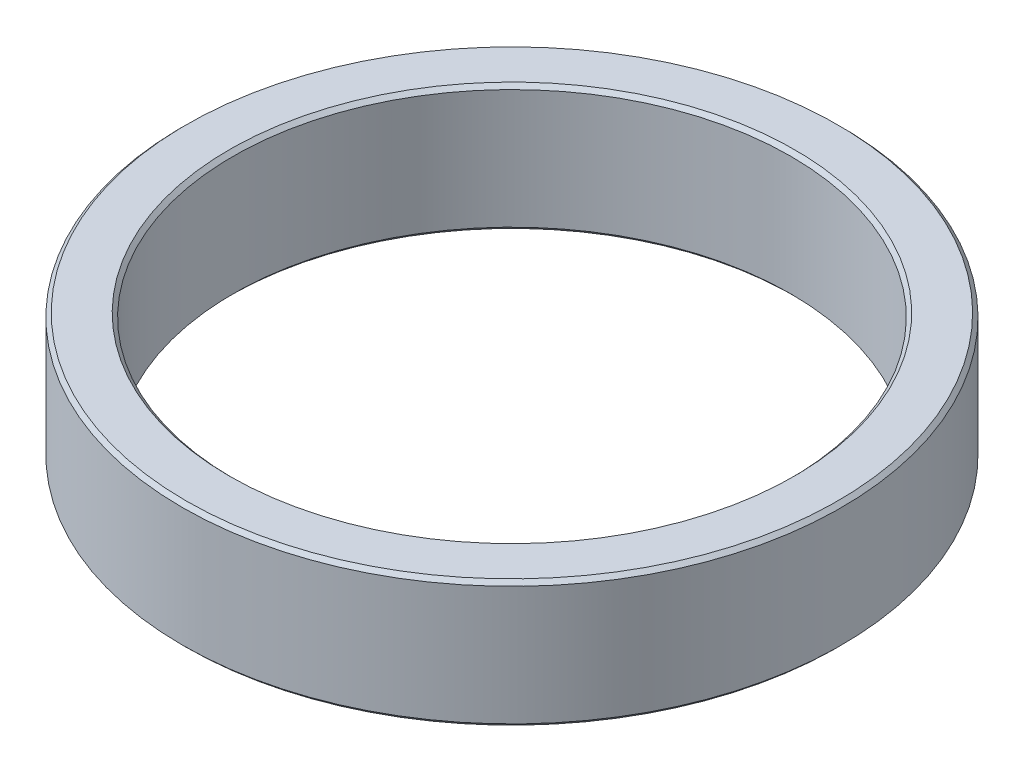
ISO-10303-21;
HEADER;
FILE_DESCRIPTION(('STEP AP214'),'2;1');
FILE_NAME('part.step','',(''),(''),'','','');
FILE_SCHEMA(('AUTOMOTIVE_DESIGN { 1 0 10303 214 1 1 1 1 }'));
ENDSEC;
DATA;
#1=APPLICATION_CONTEXT('core data for automotive mechanical design processes');
#2=APPLICATION_PROTOCOL_DEFINITION('international standard','automotive_design',2000,#1);
#3=PRODUCT_CONTEXT('',#1,'mechanical');
#4=PRODUCT('Part','Part','',(#3));
#5=PRODUCT_RELATED_PRODUCT_CATEGORY('part','',(#4));
#6=PRODUCT_DEFINITION_FORMATION('','',#4);
#7=PRODUCT_DEFINITION_CONTEXT('part definition',#1,'design');
#8=PRODUCT_DEFINITION('design','',#6,#7);
#9=PRODUCT_DEFINITION_SHAPE('','',#8);
#10=(LENGTH_UNIT() NAMED_UNIT(*) SI_UNIT(.MILLI.,.METRE.));
#11=(NAMED_UNIT(*) PLANE_ANGLE_UNIT() SI_UNIT($,.RADIAN.));
#12=(NAMED_UNIT(*) SI_UNIT($,.STERADIAN.) SOLID_ANGLE_UNIT());
#13=UNCERTAINTY_MEASURE_WITH_UNIT(LENGTH_MEASURE(1.E-05),#10,'distance_accuracy_value','');
#14=(GEOMETRIC_REPRESENTATION_CONTEXT(3) GLOBAL_UNCERTAINTY_ASSIGNED_CONTEXT((#13)) GLOBAL_UNIT_ASSIGNED_CONTEXT((#10,
#11,#12)) REPRESENTATION_CONTEXT('',''));
#15=CARTESIAN_POINT('',(0.,0.,0.));
#16=DIRECTION('',(0.,0.,1.));
#17=DIRECTION('',(1.,0.,0.));
#18=AXIS2_PLACEMENT_3D('',#15,#16,#17);
#19=CARTESIAN_POINT('',(0.,5.,0.));
#20=DIRECTION('',(0.,1.,0.));
#21=DIRECTION('',(0.,0.,1.));
#22=AXIS2_PLACEMENT_3D('',#19,#20,#21);
#23=PLANE('',#22);
#24=CARTESIAN_POINT('',(0.,5.,0.));
#25=DIRECTION('',(0.,1.,0.));
#26=DIRECTION('',(0.,0.,1.));
#27=AXIS2_PLACEMENT_3D('',#24,#25,#26);
#28=CIRCLE('',#27,11.15);
#29=CARTESIAN_POINT('',(0.,5.,11.15));
#30=VERTEX_POINT('',#29);
#31=EDGE_CURVE('E10',#30,#30,#28,.F.);
#32=ORIENTED_EDGE('',*,*,#31,.T.);
#33=EDGE_LOOP('',(#32));
#34=FACE_BOUND('',#33,.T.);
#35=CARTESIAN_POINT('',(0.,5.,0.));
#36=DIRECTION('',(0.,1.,0.));
#37=DIRECTION('',(0.,0.,1.));
#38=AXIS2_PLACEMENT_3D('',#35,#36,#37);
#39=CIRCLE('',#38,12.85);
#40=CARTESIAN_POINT('',(0.,5.,12.85));
#41=VERTEX_POINT('',#40);
#42=EDGE_CURVE('E41',#41,#41,#39,.T.);
#43=ORIENTED_EDGE('',*,*,#42,.T.);
#44=EDGE_LOOP('',(#43));
#45=FACE_BOUND('',#44,.T.);
#46=ADVANCED_FACE('F33',(#34,#45),#23,.T.);
#47=CARTESIAN_POINT('',(0.,0.,0.));
#48=DIRECTION('',(0.,1.,0.));
#49=DIRECTION('',(0.,0.,1.));
#50=AXIS2_PLACEMENT_3D('',#47,#48,#49);
#51=PLANE('',#50);
#52=CARTESIAN_POINT('',(0.,0.,0.));
#53=DIRECTION('',(0.,1.,0.));
#54=DIRECTION('',(0.,0.,1.));
#55=AXIS2_PLACEMENT_3D('',#52,#53,#54);
#56=CIRCLE('',#55,11.15);
#57=CARTESIAN_POINT('',(0.,0.,11.15));
#58=VERTEX_POINT('',#57);
#59=EDGE_CURVE('E60',#58,#58,#56,.T.);
#60=ORIENTED_EDGE('',*,*,#59,.T.);
#61=EDGE_LOOP('',(#60));
#62=FACE_BOUND('',#61,.T.);
#63=CARTESIAN_POINT('',(0.,0.,0.));
#64=DIRECTION('',(0.,1.,0.));
#65=DIRECTION('',(0.,0.,1.));
#66=AXIS2_PLACEMENT_3D('',#63,#64,#65);
#67=CIRCLE('',#66,12.85);
#68=CARTESIAN_POINT('',(0.,0.,12.85));
#69=VERTEX_POINT('',#68);
#70=EDGE_CURVE('E63',#69,#69,#67,.F.);
#71=ORIENTED_EDGE('',*,*,#70,.T.);
#72=EDGE_LOOP('',(#71));
#73=FACE_BOUND('',#72,.T.);
#74=ADVANCED_FACE('F67',(#62,#73),#51,.F.);
#75=CARTESIAN_POINT('',(0.,5.,0.));
#76=DIRECTION('',(0.,-1.,0.));
#77=DIRECTION('',(0.,0.,-1.));
#78=AXIS2_PLACEMENT_3D('',#75,#76,#77);
#79=CYLINDRICAL_SURFACE('',#78,13.);
#80=CARTESIAN_POINT('',(0.,0.150000000000003,0.));
#81=DIRECTION('',(0.,1.,0.));
#82=DIRECTION('',(0.,0.,1.));
#83=AXIS2_PLACEMENT_3D('',#80,#81,#82);
#84=CIRCLE('',#83,13.);
#85=CARTESIAN_POINT('',(0.,0.150000000000003,13.));
#86=VERTEX_POINT('',#85);
#87=EDGE_CURVE('E45',#86,#86,#84,.T.);
#88=ORIENTED_EDGE('',*,*,#87,.T.);
#89=EDGE_LOOP('',(#88));
#90=FACE_BOUND('',#89,.T.);
#91=CARTESIAN_POINT('',(0.,4.85000000000001,0.));
#92=DIRECTION('',(0.,1.,0.));
#93=DIRECTION('',(0.,0.,1.));
#94=AXIS2_PLACEMENT_3D('',#91,#92,#93);
#95=CIRCLE('',#94,13.);
#96=CARTESIAN_POINT('',(0.,4.85000000000001,13.));
#97=VERTEX_POINT('',#96);
#98=EDGE_CURVE('E49',#97,#97,#95,.F.);
#99=ORIENTED_EDGE('',*,*,#98,.T.);
#100=EDGE_LOOP('',(#99));
#101=FACE_BOUND('',#100,.T.);
#102=ADVANCED_FACE('F77',(#90,#101),#79,.T.);
#103=CARTESIAN_POINT('',(0.,5.,0.));
#104=DIRECTION('',(0.,-1.,0.));
#105=DIRECTION('',(0.,0.,-1.));
#106=AXIS2_PLACEMENT_3D('',#103,#104,#105);
#107=CYLINDRICAL_SURFACE('',#106,11.);
#108=CARTESIAN_POINT('',(0.,0.150000000000001,0.));
#109=DIRECTION('',(0.,1.,0.));
#110=DIRECTION('',(0.,0.,1.));
#111=AXIS2_PLACEMENT_3D('',#108,#109,#110);
#112=CIRCLE('',#111,11.);
#113=CARTESIAN_POINT('',(0.,0.150000000000001,11.));
#114=VERTEX_POINT('',#113);
#115=EDGE_CURVE('E54',#114,#114,#112,.F.);
#116=ORIENTED_EDGE('',*,*,#115,.T.);
#117=EDGE_LOOP('',(#116));
#118=FACE_BOUND('',#117,.T.);
#119=CARTESIAN_POINT('',(0.,4.85,0.));
#120=DIRECTION('',(0.,1.,0.));
#121=DIRECTION('',(0.,0.,1.));
#122=AXIS2_PLACEMENT_3D('',#119,#120,#121);
#123=CIRCLE('',#122,11.);
#124=CARTESIAN_POINT('',(0.,4.85,11.));
#125=VERTEX_POINT('',#124);
#126=EDGE_CURVE('E57',#125,#125,#123,.T.);
#127=ORIENTED_EDGE('',*,*,#126,.T.);
#128=EDGE_LOOP('',(#127));
#129=FACE_BOUND('',#128,.T.);
#130=ADVANCED_FACE('F80',(#118,#129),#107,.F.);
#131=CARTESIAN_POINT('',(0.,0.,0.));
#132=DIRECTION('',(0.,-1.,0.));
#133=DIRECTION('',(0.,0.,-1.));
#134=AXIS2_PLACEMENT_3D('',#131,#132,#133);
#135=CONICAL_SURFACE('',#134,11.15,0.785398163397448);
#136=ORIENTED_EDGE('',*,*,#115,.F.);
#137=EDGE_LOOP('',(#136));
#138=FACE_BOUND('',#137,.T.);
#139=ORIENTED_EDGE('',*,*,#59,.F.);
#140=EDGE_LOOP('',(#139));
#141=FACE_BOUND('',#140,.T.);
#142=ADVANCED_FACE('F73',(#138,#141),#135,.F.);
#143=CARTESIAN_POINT('',(0.,0.150000000000003,0.));
#144=DIRECTION('',(0.,1.,0.));
#145=DIRECTION('',(0.,0.,1.));
#146=AXIS2_PLACEMENT_3D('',#143,#144,#145);
#147=CONICAL_SURFACE('',#146,13.,0.785398163397448);
#148=CARTESIAN_POINT('',(0.,0.,12.85));
#149=CARTESIAN_POINT('',(0.,0.00156250000000041,12.8515625));
#150=CARTESIAN_POINT('',(0.,0.0031250000000003,12.853125));
#151=CARTESIAN_POINT('',(0.,0.00625000000000009,12.85625));
#152=CARTESIAN_POINT('',(0.,0.00781249999999999,12.8578125));
#153=CARTESIAN_POINT('',(0.,0.0109375,12.8609375));
#154=CARTESIAN_POINT('',(0.,0.0125000000000001,12.8625));
#155=CARTESIAN_POINT('',(0.,0.0156250000000003,12.865625));
#156=CARTESIAN_POINT('',(0.,0.0171875000000005,12.8671875));
#157=CARTESIAN_POINT('',(0.,0.0203125000000004,12.8703125));
#158=CARTESIAN_POINT('',(0.,0.0218750000000003,12.871875));
#159=CARTESIAN_POINT('',(0.,0.0250000000000002,12.875));
#160=CARTESIAN_POINT('',(0.,0.0265625000000003,12.8765625));
#161=CARTESIAN_POINT('',(0.,0.0296875000000006,12.8796875));
#162=CARTESIAN_POINT('',(0.,0.0312500000000007,12.88125));
#163=CARTESIAN_POINT('',(0.,0.0343750000000007,12.884375));
#164=CARTESIAN_POINT('',(0.,0.0359375000000005,12.8859375));
#165=CARTESIAN_POINT('',(0.,0.0390625000000005,12.8890625));
#166=CARTESIAN_POINT('',(0.,0.0406250000000006,12.890625));
#167=CARTESIAN_POINT('',(0.,0.0437500000000008,12.89375));
#168=CARTESIAN_POINT('',(0.,0.0453125000000009,12.8953125));
#169=CARTESIAN_POINT('',(0.,0.0484375000000009,12.8984375));
#170=CARTESIAN_POINT('',(0.,0.0500000000000007,12.9));
#171=CARTESIAN_POINT('',(0.,0.0531250000000007,12.903125));
#172=CARTESIAN_POINT('',(0.,0.0546875000000008,12.9046875));
#173=CARTESIAN_POINT('',(0.,0.0578125000000011,12.9078125));
#174=CARTESIAN_POINT('',(0.,0.0593750000000012,12.909375));
#175=CARTESIAN_POINT('',(0.,0.0625000000000012,12.9125));
#176=CARTESIAN_POINT('',(0.,0.064062500000001,12.9140625));
#177=CARTESIAN_POINT('',(0.,0.0671875000000009,12.9171875));
#178=CARTESIAN_POINT('',(0.,0.0687500000000011,12.91875));
#179=CARTESIAN_POINT('',(0.,0.0718750000000013,12.921875));
#180=CARTESIAN_POINT('',(0.,0.0734375000000015,12.9234375));
#181=CARTESIAN_POINT('',(0.,0.0765625000000014,12.9265625));
#182=CARTESIAN_POINT('',(0.,0.0781250000000012,12.928125));
#183=CARTESIAN_POINT('',(0.,0.0812500000000012,12.93125));
#184=CARTESIAN_POINT('',(0.,0.0828125000000015,12.9328125));
#185=CARTESIAN_POINT('',(0.,0.0859375000000016,12.9359375));
#186=CARTESIAN_POINT('',(0.,0.0875000000000014,12.9375));
#187=CARTESIAN_POINT('',(0.,0.0906250000000013,12.940625));
#188=CARTESIAN_POINT('',(0.,0.0921875000000014,12.9421875));
#189=CARTESIAN_POINT('',(0.,0.0953125000000017,12.9453125));
#190=CARTESIAN_POINT('',(0.,0.0968750000000018,12.946875));
#191=CARTESIAN_POINT('',(0.,0.100000000000002,12.95));
#192=CARTESIAN_POINT('',(0.,0.101562500000002,12.9515625));
#193=CARTESIAN_POINT('',(0.,0.104687500000002,12.9546875));
#194=CARTESIAN_POINT('',(0.,0.106250000000002,12.95625));
#195=CARTESIAN_POINT('',(0.,0.109375000000002,12.959375));
#196=CARTESIAN_POINT('',(0.,0.110937500000002,12.9609375));
#197=CARTESIAN_POINT('',(0.,0.114062500000002,12.9640625));
#198=CARTESIAN_POINT('',(0.,0.115625000000002,12.965625));
#199=CARTESIAN_POINT('',(0.,0.118750000000002,12.96875));
#200=CARTESIAN_POINT('',(0.,0.120312500000002,12.9703125));
#201=CARTESIAN_POINT('',(0.,0.123437500000002,12.9734375));
#202=CARTESIAN_POINT('',(0.,0.125000000000002,12.975));
#203=CARTESIAN_POINT('',(0.,0.128125000000002,12.978125));
#204=CARTESIAN_POINT('',(0.,0.129687500000002,12.9796875));
#205=CARTESIAN_POINT('',(0.,0.132812500000002,12.9828125));
#206=CARTESIAN_POINT('',(0.,0.134375000000002,12.984375));
#207=CARTESIAN_POINT('',(0.,0.137500000000002,12.9875));
#208=CARTESIAN_POINT('',(0.,0.139062500000003,12.9890625));
#209=CARTESIAN_POINT('',(0.,0.142187500000003,12.9921875));
#210=CARTESIAN_POINT('',(0.,0.143750000000002,12.99375));
#211=CARTESIAN_POINT('',(0.,0.146875000000002,12.996875));
#212=CARTESIAN_POINT('',(0.,0.148437500000002,12.9984375));
#213=CARTESIAN_POINT('',(0.,0.150000000000003,13.));
#214=B_SPLINE_CURVE_WITH_KNOTS('',3,(#148,#149,#150,#151,#152,#153,#154,#155,#156,#157,#158,
#159,#160,#161,#162,#163,#164,#165,#166,#167,#168,#169,#170,#171,#172,#173,#174,#175,#176,#177,
#178,#179,#180,#181,#182,#183,#184,#185,#186,#187,#188,#189,#190,#191,#192,#193,#194,#195,#196,
#197,#198,#199,#200,#201,#202,#203,#204,#205,#206,#207,#208,#209,#210,#211,#212,#213),
.UNSPECIFIED.,.F.,.F.,(4,2,2,2,2,2,2,2,2,2,2,2,2,2,2,2,2,2,2,2,2,2,2,2,2,2,2,2,2,2,2,2,4),(0.,
0.00662912607362357,0.0132582521472484,0.0198873782208719,0.0265165042944955,0.0331456303681203,
0.0397747564417439,0.0464038825153675,0.0530330085889923,0.0596621346626158,0.0662912607362394,
0.0729203868098642,0.0795495128834878,0.0861786389571114,0.0928077650307362,0.0994368911043598,
0.106066017177983,0.112695143251608,0.119324269325232,0.125953395398857,0.13258252147248,
0.139211647546104,0.145840773619728,0.152469899693352,0.159099025766976,0.1657281518406,
0.172357277914224,0.178986403987848,0.185615530061472,0.192244656135096,0.19887378220872,
0.205502908282344,0.212132034355968),.UNSPECIFIED.);
#215=EDGE_CURVE('BSEAM69',#69,#86,#214,.T.);
#216=ORIENTED_EDGE('',*,*,#70,.F.);
#217=ORIENTED_EDGE('',*,*,#87,.F.);
#218=ORIENTED_EDGE('',*,*,#215,.T.);
#219=ORIENTED_EDGE('',*,*,#215,.F.);
#220=EDGE_LOOP('',(#216,#218,#217,#219));
#221=FACE_BOUND('',#220,.T.);
#222=ADVANCED_FACE('F69',(#221),#147,.T.);
#223=CARTESIAN_POINT('',(0.,4.85,0.));
#224=DIRECTION('',(0.,1.,0.));
#225=DIRECTION('',(0.,0.,1.));
#226=AXIS2_PLACEMENT_3D('',#223,#224,#225);
#227=CONICAL_SURFACE('',#226,11.,0.78539816339746);
#228=ORIENTED_EDGE('',*,*,#31,.F.);
#229=EDGE_LOOP('',(#228));
#230=FACE_BOUND('',#229,.T.);
#231=ORIENTED_EDGE('',*,*,#126,.F.);
#232=EDGE_LOOP('',(#231));
#233=FACE_BOUND('',#232,.T.);
#234=ADVANCED_FACE('F72',(#230,#233),#227,.F.);
#235=CARTESIAN_POINT('',(0.,5.,0.));
#236=DIRECTION('',(0.,-1.,0.));
#237=DIRECTION('',(0.,0.,-1.));
#238=AXIS2_PLACEMENT_3D('',#235,#236,#237);
#239=CONICAL_SURFACE('',#238,12.85,0.785398163397431);
#240=ORIENTED_EDGE('',*,*,#98,.F.);
#241=EDGE_LOOP('',(#240));
#242=FACE_BOUND('',#241,.T.);
#243=ORIENTED_EDGE('',*,*,#42,.F.);
#244=EDGE_LOOP('',(#243));
#245=FACE_BOUND('',#244,.T.);
#246=ADVANCED_FACE('F36',(#242,#245),#239,.T.);
#247=CLOSED_SHELL('',(#46,#74,#102,#130,#142,#222,#234,#246));
#248=MANIFOLD_SOLID_BREP('B2',#247);
#249=ADVANCED_BREP_SHAPE_REPRESENTATION('',(#18,#248),#14);
#250=SHAPE_DEFINITION_REPRESENTATION(#9,#249);
ENDSEC;
END-ISO-10303-21;
